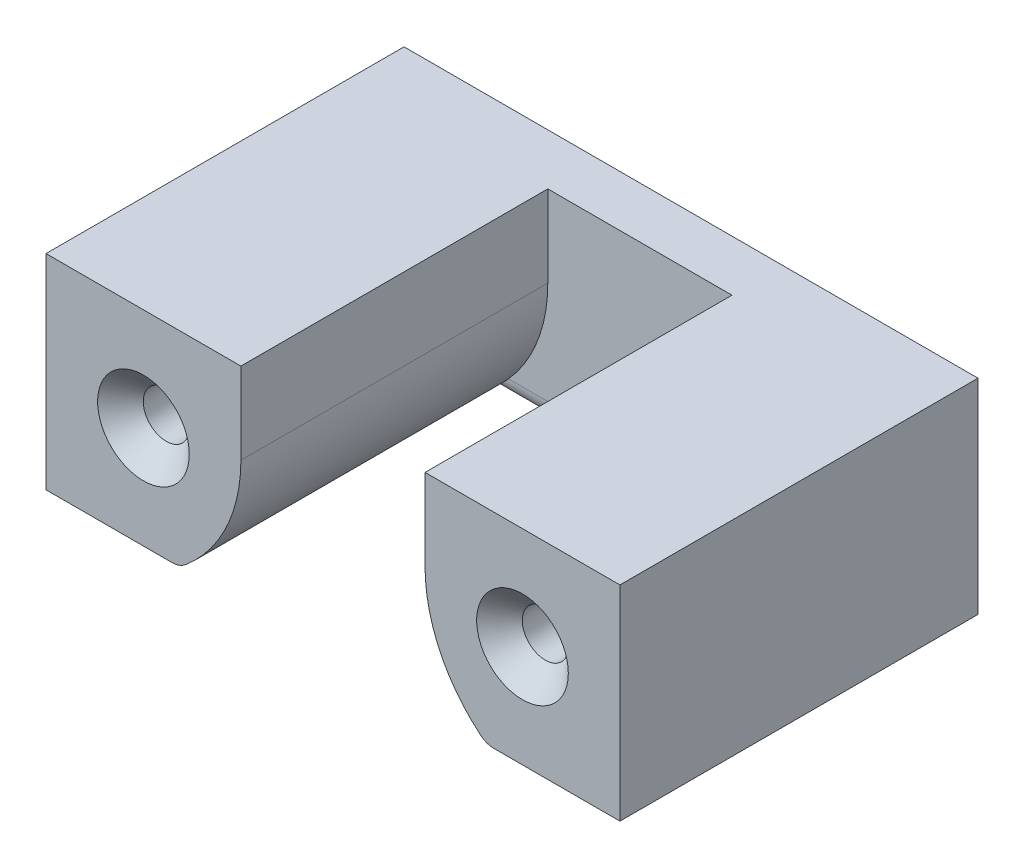
ISO-10303-21;
HEADER;
FILE_DESCRIPTION(('STEP AP214'),'2;1');
FILE_NAME('part.step','',(''),(''),'','','');
FILE_SCHEMA(('AUTOMOTIVE_DESIGN { 1 0 10303 214 1 1 1 1 }'));
ENDSEC;
DATA;
#1=APPLICATION_CONTEXT('core data for automotive mechanical design processes');
#2=APPLICATION_PROTOCOL_DEFINITION('international standard','automotive_design',2000,#1);
#3=PRODUCT_CONTEXT('',#1,'mechanical');
#4=PRODUCT('Part','Part','',(#3));
#5=PRODUCT_RELATED_PRODUCT_CATEGORY('part','',(#4));
#6=PRODUCT_DEFINITION_FORMATION('','',#4);
#7=PRODUCT_DEFINITION_CONTEXT('part definition',#1,'design');
#8=PRODUCT_DEFINITION('design','',#6,#7);
#9=PRODUCT_DEFINITION_SHAPE('','',#8);
#10=(LENGTH_UNIT() NAMED_UNIT(*) SI_UNIT(.MILLI.,.METRE.));
#11=(NAMED_UNIT(*) PLANE_ANGLE_UNIT() SI_UNIT($,.RADIAN.));
#12=(NAMED_UNIT(*) SI_UNIT($,.STERADIAN.) SOLID_ANGLE_UNIT());
#13=UNCERTAINTY_MEASURE_WITH_UNIT(LENGTH_MEASURE(1.E-05),#10,'distance_accuracy_value','');
#14=(GEOMETRIC_REPRESENTATION_CONTEXT(3) GLOBAL_UNCERTAINTY_ASSIGNED_CONTEXT((#13)) GLOBAL_UNIT_ASSIGNED_CONTEXT((#10,
#11,#12)) REPRESENTATION_CONTEXT('',''));
#15=CARTESIAN_POINT('',(0.,0.,0.));
#16=DIRECTION('',(0.,0.,1.));
#17=DIRECTION('',(1.,0.,0.));
#18=AXIS2_PLACEMENT_3D('',#15,#16,#17);
#19=CARTESIAN_POINT('',(0.,0.,5.));
#20=DIRECTION('',(0.,0.,-1.));
#21=DIRECTION('',(-1.,0.,0.));
#22=AXIS2_PLACEMENT_3D('',#19,#20,#21);
#23=PLANE('',#22);
#24=CARTESIAN_POINT('',(4.05,12.0256241897666,5.));
#25=DIRECTION('',(0.,0.,1.));
#26=DIRECTION('',(1.,0.,0.));
#27=AXIS2_PLACEMENT_3D('',#24,#25,#26);
#28=CIRCLE('',#27,15.);
#29=CARTESIAN_POINT('',(15.2073679515182,2.,5.));
#30=VERTEX_POINT('',#29);
#31=CARTESIAN_POINT('',(19.05,12.0256241897666,5.));
#32=VERTEX_POINT('',#31);
#33=EDGE_CURVE('E165',#30,#32,#28,.T.);
#34=ORIENTED_EDGE('',*,*,#33,.F.);
#35=DIRECTION('',(1.,0.,0.));
#36=VECTOR('',#35,1.);
#37=CARTESIAN_POINT('',(0.,2.,5.));
#38=LINE('',#37,#36);
#39=CARTESIAN_POINT('',(40.8926320484818,2.,5.));
#40=VERTEX_POINT('',#39);
#41=EDGE_CURVE('E296',#30,#40,#38,.T.);
#42=ORIENTED_EDGE('',*,*,#41,.T.);
#43=CARTESIAN_POINT('',(52.05,12.0256241897666,5.));
#44=DIRECTION('',(0.,0.,1.));
#45=DIRECTION('',(1.,0.,0.));
#46=AXIS2_PLACEMENT_3D('',#43,#44,#45);
#47=CIRCLE('',#46,15.);
#48=CARTESIAN_POINT('',(37.05,12.0256241897666,5.));
#49=VERTEX_POINT('',#48);
#50=EDGE_CURVE('E186',#40,#49,#47,.F.);
#51=ORIENTED_EDGE('',*,*,#50,.T.);
#52=DIRECTION('',(0.,-1.,0.));
#53=VECTOR('',#52,1.);
#54=CARTESIAN_POINT('',(37.05,0.,5.));
#55=LINE('',#54,#53);
#56=CARTESIAN_POINT('',(37.05,20.,5.));
#57=VERTEX_POINT('',#56);
#58=EDGE_CURVE('E182',#57,#49,#55,.T.);
#59=ORIENTED_EDGE('',*,*,#58,.F.);
#60=DIRECTION('',(1.,0.,0.));
#61=VECTOR('',#60,1.);
#62=CARTESIAN_POINT('',(0.,20.,5.));
#63=LINE('',#62,#61);
#64=CARTESIAN_POINT('',(19.05,20.,5.));
#65=VERTEX_POINT('',#64);
#66=EDGE_CURVE('E250',#65,#57,#63,.T.);
#67=ORIENTED_EDGE('',*,*,#66,.F.);
#68=DIRECTION('',(0.,-1.,0.));
#69=VECTOR('',#68,1.);
#70=CARTESIAN_POINT('',(19.05,0.,5.));
#71=LINE('',#70,#69);
#72=EDGE_CURVE('E215',#65,#32,#71,.T.);
#73=ORIENTED_EDGE('',*,*,#72,.T.);
#74=EDGE_LOOP('',(#34,#42,#51,#59,#67,#73));
#75=FACE_BOUND('',#74,.T.);
#76=ADVANCED_FACE('F47',(#75),#23,.F.);
#77=CARTESIAN_POINT('',(0.,0.,5.));
#78=DIRECTION('',(-1.,0.,0.));
#79=DIRECTION('',(0.,0.,1.));
#80=AXIS2_PLACEMENT_3D('',#77,#78,#79);
#81=PLANE('',#80);
#82=DIRECTION('',(0.,1.,0.));
#83=VECTOR('',#82,1.);
#84=CARTESIAN_POINT('',(0.,0.,0.));
#85=LINE('',#84,#83);
#86=CARTESIAN_POINT('',(0.,0.,0.));
#87=VERTEX_POINT('',#86);
#88=CARTESIAN_POINT('',(0.,20.,0.));
#89=VERTEX_POINT('',#88);
#90=EDGE_CURVE('E249',#87,#89,#85,.T.);
#91=ORIENTED_EDGE('',*,*,#90,.F.);
#92=DIRECTION('',(0.,0.,-1.));
#93=VECTOR('',#92,1.);
#94=CARTESIAN_POINT('',(0.,0.,5.));
#95=LINE('',#94,#93);
#96=CARTESIAN_POINT('',(0.,0.,35.));
#97=VERTEX_POINT('',#96);
#98=EDGE_CURVE('E269',#97,#87,#95,.T.);
#99=ORIENTED_EDGE('',*,*,#98,.F.);
#100=DIRECTION('',(0.,-1.,0.));
#101=VECTOR('',#100,1.);
#102=CARTESIAN_POINT('',(0.,0.,35.));
#103=LINE('',#102,#101);
#104=CARTESIAN_POINT('',(0.,20.,35.));
#105=VERTEX_POINT('',#104);
#106=EDGE_CURVE('E226',#105,#97,#103,.T.);
#107=ORIENTED_EDGE('',*,*,#106,.F.);
#108=DIRECTION('',(0.,0.,-1.));
#109=VECTOR('',#108,1.);
#110=CARTESIAN_POINT('',(0.,20.,5.));
#111=LINE('',#110,#109);
#112=EDGE_CURVE('E254',#105,#89,#111,.T.);
#113=ORIENTED_EDGE('',*,*,#112,.T.);
#114=EDGE_LOOP('',(#91,#99,#107,#113));
#115=FACE_BOUND('',#114,.T.);
#116=ADVANCED_FACE('F391',(#115),#81,.T.);
#117=CARTESIAN_POINT('',(0.,0.,5.));
#118=DIRECTION('',(0.,1.,0.));
#119=DIRECTION('',(0.,0.,1.));
#120=AXIS2_PLACEMENT_3D('',#117,#118,#119);
#121=PLANE('',#120);
#122=DIRECTION('',(1.,0.,0.));
#123=VECTOR('',#122,1.);
#124=CARTESIAN_POINT('',(0.,0.,35.));
#125=LINE('',#124,#123);
#126=CARTESIAN_POINT('',(43.7740998703627,0.,35.));
#127=VERTEX_POINT('',#126);
#128=CARTESIAN_POINT('',(56.1,0.,35.));
#129=VERTEX_POINT('',#128);
#130=EDGE_CURVE('E175',#127,#129,#125,.T.);
#131=ORIENTED_EDGE('',*,*,#130,.F.);
#132=DIRECTION('',(0.,0.,-1.));
#133=VECTOR('',#132,1.);
#134=CARTESIAN_POINT('',(43.7740998703627,0.,5.));
#135=LINE('',#134,#133);
#136=CARTESIAN_POINT('',(43.7740998703627,0.,3.));
#137=VERTEX_POINT('',#136);
#138=EDGE_CURVE('E287',#127,#137,#135,.T.);
#139=ORIENTED_EDGE('',*,*,#138,.T.);
#140=DIRECTION('',(1.,0.,0.));
#141=VECTOR('',#140,1.);
#142=CARTESIAN_POINT('',(0.,0.,3.));
#143=LINE('',#142,#141);
#144=CARTESIAN_POINT('',(12.3259001296373,0.,3.));
#145=VERTEX_POINT('',#144);
#146=EDGE_CURVE('E284',#137,#145,#143,.F.);
#147=ORIENTED_EDGE('',*,*,#146,.T.);
#148=DIRECTION('',(0.,0.,-1.));
#149=VECTOR('',#148,1.);
#150=CARTESIAN_POINT('',(12.3259001296373,0.,35.));
#151=LINE('',#150,#149);
#152=CARTESIAN_POINT('',(12.3259001296373,0.,35.));
#153=VERTEX_POINT('',#152);
#154=EDGE_CURVE('E272',#145,#153,#151,.F.);
#155=ORIENTED_EDGE('',*,*,#154,.T.);
#156=DIRECTION('',(1.,0.,0.));
#157=VECTOR('',#156,1.);
#158=CARTESIAN_POINT('',(0.,0.,35.));
#159=LINE('',#158,#157);
#160=EDGE_CURVE('E230',#97,#153,#159,.T.);
#161=ORIENTED_EDGE('',*,*,#160,.F.);
#162=ORIENTED_EDGE('',*,*,#98,.T.);
#163=DIRECTION('',(1.,0.,0.));
#164=VECTOR('',#163,1.);
#165=CARTESIAN_POINT('',(0.,0.,0.));
#166=LINE('',#165,#164);
#167=CARTESIAN_POINT('',(56.1,0.,0.));
#168=VERTEX_POINT('',#167);
#169=EDGE_CURVE('E255',#87,#168,#166,.T.);
#170=ORIENTED_EDGE('',*,*,#169,.T.);
#171=DIRECTION('',(0.,0.,-1.));
#172=VECTOR('',#171,1.);
#173=CARTESIAN_POINT('',(56.1,0.,5.));
#174=LINE('',#173,#172);
#175=EDGE_CURVE('E273',#129,#168,#174,.T.);
#176=ORIENTED_EDGE('',*,*,#175,.F.);
#177=EDGE_LOOP('',(#131,#139,#147,#155,#161,#162,#170,#176));
#178=FACE_BOUND('',#177,.T.);
#179=ADVANCED_FACE('F403',(#178),#121,.F.);
#180=CARTESIAN_POINT('',(56.1,0.,5.));
#181=DIRECTION('',(-1.,0.,0.));
#182=DIRECTION('',(0.,0.,1.));
#183=AXIS2_PLACEMENT_3D('',#180,#181,#182);
#184=PLANE('',#183);
#185=DIRECTION('',(0.,1.,0.));
#186=VECTOR('',#185,1.);
#187=CARTESIAN_POINT('',(56.1,0.,0.));
#188=LINE('',#187,#186);
#189=CARTESIAN_POINT('',(56.1,20.,0.));
#190=VERTEX_POINT('',#189);
#191=EDGE_CURVE('E263',#168,#190,#188,.T.);
#192=ORIENTED_EDGE('',*,*,#191,.T.);
#193=DIRECTION('',(0.,0.,-1.));
#194=VECTOR('',#193,1.);
#195=CARTESIAN_POINT('',(56.1,20.,5.));
#196=LINE('',#195,#194);
#197=CARTESIAN_POINT('',(56.1,20.,35.));
#198=VERTEX_POINT('',#197);
#199=EDGE_CURVE('E277',#198,#190,#196,.T.);
#200=ORIENTED_EDGE('',*,*,#199,.F.);
#201=DIRECTION('',(0.,1.,0.));
#202=VECTOR('',#201,1.);
#203=CARTESIAN_POINT('',(56.1,0.,35.));
#204=LINE('',#203,#202);
#205=EDGE_CURVE('E194',#129,#198,#204,.T.);
#206=ORIENTED_EDGE('',*,*,#205,.F.);
#207=ORIENTED_EDGE('',*,*,#175,.T.);
#208=EDGE_LOOP('',(#192,#200,#206,#207));
#209=FACE_BOUND('',#208,.T.);
#210=ADVANCED_FACE('F399',(#209),#184,.F.);
#211=CARTESIAN_POINT('',(0.,20.,5.));
#212=DIRECTION('',(0.,1.,0.));
#213=DIRECTION('',(0.,0.,1.));
#214=AXIS2_PLACEMENT_3D('',#211,#212,#213);
#215=PLANE('',#214);
#216=DIRECTION('',(1.,0.,0.));
#217=VECTOR('',#216,1.);
#218=CARTESIAN_POINT('',(0.,20.,0.));
#219=LINE('',#218,#217);
#220=EDGE_CURVE('E259',#89,#190,#219,.T.);
#221=ORIENTED_EDGE('',*,*,#220,.F.);
#222=ORIENTED_EDGE('',*,*,#112,.F.);
#223=DIRECTION('',(-1.,0.,0.));
#224=VECTOR('',#223,1.);
#225=CARTESIAN_POINT('',(0.,20.,35.));
#226=LINE('',#225,#224);
#227=CARTESIAN_POINT('',(19.05,20.,35.));
#228=VERTEX_POINT('',#227);
#229=EDGE_CURVE('E222',#228,#105,#226,.T.);
#230=ORIENTED_EDGE('',*,*,#229,.F.);
#231=DIRECTION('',(0.,0.,-1.));
#232=VECTOR('',#231,1.);
#233=CARTESIAN_POINT('',(19.05,20.,35.));
#234=LINE('',#233,#232);
#235=EDGE_CURVE('E234',#228,#65,#234,.T.);
#236=ORIENTED_EDGE('',*,*,#235,.T.);
#237=ORIENTED_EDGE('',*,*,#66,.T.);
#238=DIRECTION('',(0.,0.,-1.));
#239=VECTOR('',#238,1.);
#240=CARTESIAN_POINT('',(37.05,20.,35.));
#241=LINE('',#240,#239);
#242=CARTESIAN_POINT('',(37.05,20.,35.));
#243=VERTEX_POINT('',#242);
#244=EDGE_CURVE('E166',#243,#57,#241,.T.);
#245=ORIENTED_EDGE('',*,*,#244,.F.);
#246=DIRECTION('',(-1.,0.,0.));
#247=VECTOR('',#246,1.);
#248=CARTESIAN_POINT('',(0.,20.,35.));
#249=LINE('',#248,#247);
#250=EDGE_CURVE('E198',#198,#243,#249,.T.);
#251=ORIENTED_EDGE('',*,*,#250,.F.);
#252=ORIENTED_EDGE('',*,*,#199,.T.);
#253=EDGE_LOOP('',(#221,#222,#230,#236,#237,#245,#251,#252));
#254=FACE_BOUND('',#253,.T.);
#255=ADVANCED_FACE('F383',(#254),#215,.T.);
#256=CARTESIAN_POINT('',(0.,0.,0.));
#257=DIRECTION('',(0.,0.,-1.));
#258=DIRECTION('',(-1.,0.,0.));
#259=AXIS2_PLACEMENT_3D('',#256,#257,#258);
#260=PLANE('',#259);
#261=CARTESIAN_POINT('',(9.525,10.,0.));
#262=DIRECTION('',(0.,0.,-1.));
#263=DIRECTION('',(-1.,0.,0.));
#264=AXIS2_PLACEMENT_3D('',#261,#262,#263);
#265=CIRCLE('',#264,2.25);
#266=CARTESIAN_POINT('',(7.275,10.,0.));
#267=VERTEX_POINT('',#266);
#268=EDGE_CURVE('E360',#267,#267,#265,.T.);
#269=ORIENTED_EDGE('',*,*,#268,.F.);
#270=EDGE_LOOP('',(#269));
#271=FACE_BOUND('',#270,.T.);
#272=CARTESIAN_POINT('',(46.575,10.,0.));
#273=DIRECTION('',(0.,0.,-1.));
#274=DIRECTION('',(-1.,0.,0.));
#275=AXIS2_PLACEMENT_3D('',#272,#273,#274);
#276=CIRCLE('',#275,2.25);
#277=CARTESIAN_POINT('',(44.325,10.,0.));
#278=VERTEX_POINT('',#277);
#279=EDGE_CURVE('E189',#278,#278,#276,.T.);
#280=ORIENTED_EDGE('',*,*,#279,.F.);
#281=EDGE_LOOP('',(#280));
#282=FACE_BOUND('',#281,.T.);
#283=ORIENTED_EDGE('',*,*,#90,.T.);
#284=ORIENTED_EDGE('',*,*,#220,.T.);
#285=ORIENTED_EDGE('',*,*,#191,.F.);
#286=ORIENTED_EDGE('',*,*,#169,.F.);
#287=EDGE_LOOP('',(#283,#284,#285,#286));
#288=FACE_BOUND('',#287,.T.);
#289=ADVANCED_FACE('F380',(#271,#282,#288),#260,.T.);
#290=CARTESIAN_POINT('',(5.34836065573767,-6.41803278688524,35.));
#291=DIRECTION('',(0.640184399664477,-0.768221279597378,0.));
#292=DIRECTION('',(0.768221279597378,0.640184399664477,0.));
#293=AXIS2_PLACEMENT_3D('',#290,#291,#292);
#294=PLANE('',#293);
#295=DIRECTION('',(-0.768221279597378,-0.640184399664477,0.));
#296=VECTOR('',#295,1.);
#297=CARTESIAN_POINT('',(5.34836065573767,-6.41803278688524,35.));
#298=LINE('',#297,#296);
#299=CARTESIAN_POINT('',(13.6527659949672,0.502304995805996,35.));
#300=VERTEX_POINT('',#299);
#301=CARTESIAN_POINT('',(13.6062689289663,0.463557440805246,35.));
#302=VERTEX_POINT('',#301);
#303=EDGE_CURVE('E210',#300,#302,#298,.T.);
#304=ORIENTED_EDGE('',*,*,#303,.T.);
#305=DIRECTION('',(0.,0.,-1.));
#306=VECTOR('',#305,1.);
#307=CARTESIAN_POINT('',(13.6062689289663,0.463557440805246,5.));
#308=LINE('',#307,#306);
#309=CARTESIAN_POINT('',(13.6062689289663,0.463557440805246,4.28036879932896));
#310=VERTEX_POINT('',#309);
#311=EDGE_CURVE('E299',#302,#310,#308,.T.);
#312=ORIENTED_EDGE('',*,*,#311,.T.);
#313=CARTESIAN_POINT('',(15.45,2.,3.));
#314=DIRECTION('',(0.640184399664477,-0.768221279597378,0.));
#315=DIRECTION('',(0.768221279597378,0.640184399664477,0.));
#316=AXIS2_PLACEMENT_3D('',#313,#314,#315);
#317=ELLIPSE('',#316,3.12409987036267,2.);
#318=CARTESIAN_POINT('',(13.6527659949672,0.502304995805996,4.32548469414487));
#319=VERTEX_POINT('',#318);
#320=EDGE_CURVE('E57',#310,#319,#317,.F.);
#321=ORIENTED_EDGE('',*,*,#320,.T.);
#322=DIRECTION('',(0.,0.,-1.));
#323=VECTOR('',#322,1.);
#324=CARTESIAN_POINT('',(13.6527659949672,0.502304995805996,35.));
#325=LINE('',#324,#323);
#326=EDGE_CURVE('E64',#300,#319,#325,.T.);
#327=ORIENTED_EDGE('',*,*,#326,.F.);
#328=EDGE_LOOP('',(#304,#312,#321,#327));
#329=FACE_BOUND('',#328,.T.);
#330=ADVANCED_FACE('F334',(#329),#294,.T.);
#331=CARTESIAN_POINT('',(4.05,12.0256241897666,35.));
#332=DIRECTION('',(0.,0.,-1.));
#333=DIRECTION('',(-1.,0.,0.));
#334=AXIS2_PLACEMENT_3D('',#331,#332,#333);
#335=CYLINDRICAL_SURFACE('',#334,15.);
#336=ORIENTED_EDGE('',*,*,#326,.T.);
#337=CARTESIAN_POINT('',(13.6527659949672,0.502304995805996,4.32548469414487));
#338=CARTESIAN_POINT('',(13.7054888306372,0.546232709914975,4.37507918546173));
#339=CARTESIAN_POINT('',(13.7594979169966,0.591860793693975,4.4217091785404));
#340=CARTESIAN_POINT('',(13.8693971688525,0.686108137742407,4.50925428347499));
#341=CARTESIAN_POINT('',(13.9252855919425,0.73472466015836,4.55017451714186));
#342=CARTESIAN_POINT('',(14.0384586312911,0.834716285252311,4.62667654443475));
#343=CARTESIAN_POINT('',(14.0957457320905,0.886096526688044,4.66224789144895));
#344=CARTESIAN_POINT('',(14.2111556892482,0.99126777817051,4.72809393619407));
#345=CARTESIAN_POINT('',(14.2692787980021,1.04505952709991,4.75836699641033));
#346=CARTESIAN_POINT('',(14.4587838133128,1.2233304511454,4.84821592772636));
#347=CARTESIAN_POINT('',(14.5911107551457,1.35228653267758,4.89724030216739));
#348=CARTESIAN_POINT('',(14.8541041014704,1.61859650073199,4.96810812612382));
#349=CARTESIAN_POINT('',(14.9847734606816,1.75593176665286,4.99000969528178));
#350=CARTESIAN_POINT('',(15.1446347959692,1.93051043466516,4.99908894064817));
#351=CARTESIAN_POINT('',(15.1760872657182,1.96518406452759,4.99999643009194));
#352=CARTESIAN_POINT('',(15.2073679515182,2.,5.));
#353=B_SPLINE_CURVE_WITH_KNOTS('',3,(#337,#338,#339,#340,#341,#342,#343,#344,#345,#346,#347,
#348,#349,#350,#351,#352),.UNSPECIFIED.,.F.,.F.,(4,2,2,2,2,2,2,4),(0.,0.253851827934849,
0.507474459420807,0.761586167231691,1.0157762739005,1.58703617177933,2.15706982501783,
2.29750199771418),.UNSPECIFIED.);
#354=EDGE_CURVE('E11',#319,#30,#353,.T.);
#355=ORIENTED_EDGE('',*,*,#354,.T.);
#356=ORIENTED_EDGE('',*,*,#33,.T.);
#357=DIRECTION('',(0.,0.,-1.));
#358=VECTOR('',#357,1.);
#359=CARTESIAN_POINT('',(19.05,12.0256241897666,35.));
#360=LINE('',#359,#358);
#361=CARTESIAN_POINT('',(19.05,12.0256241897666,35.));
#362=VERTEX_POINT('',#361);
#363=EDGE_CURVE('E243',#362,#32,#360,.T.);
#364=ORIENTED_EDGE('',*,*,#363,.F.);
#365=CARTESIAN_POINT('',(4.05,12.0256241897666,35.));
#366=DIRECTION('',(0.,0.,1.));
#367=DIRECTION('',(1.,0.,0.));
#368=AXIS2_PLACEMENT_3D('',#365,#366,#367);
#369=CIRCLE('',#368,15.);
#370=EDGE_CURVE('E214',#300,#362,#369,.T.);
#371=ORIENTED_EDGE('',*,*,#370,.F.);
#372=EDGE_LOOP('',(#336,#355,#356,#364,#371));
#373=FACE_BOUND('',#372,.T.);
#374=ADVANCED_FACE('F329',(#373),#335,.T.);
#375=CARTESIAN_POINT('',(19.05,0.,35.));
#376=DIRECTION('',(1.,0.,0.));
#377=DIRECTION('',(0.,0.,-1.));
#378=AXIS2_PLACEMENT_3D('',#375,#376,#377);
#379=PLANE('',#378);
#380=ORIENTED_EDGE('',*,*,#72,.F.);
#381=ORIENTED_EDGE('',*,*,#235,.F.);
#382=DIRECTION('',(0.,-1.,0.));
#383=VECTOR('',#382,1.);
#384=CARTESIAN_POINT('',(19.05,0.,35.));
#385=LINE('',#384,#383);
#386=EDGE_CURVE('E218',#228,#362,#385,.T.);
#387=ORIENTED_EDGE('',*,*,#386,.T.);
#388=ORIENTED_EDGE('',*,*,#363,.T.);
#389=EDGE_LOOP('',(#380,#381,#387,#388));
#390=FACE_BOUND('',#389,.T.);
#391=ADVANCED_FACE('F325',(#390),#379,.T.);
#392=CARTESIAN_POINT('',(0.,0.,35.));
#393=DIRECTION('',(0.,0.,1.));
#394=DIRECTION('',(1.,0.,0.));
#395=AXIS2_PLACEMENT_3D('',#392,#393,#394);
#396=PLANE('',#395);
#397=CARTESIAN_POINT('',(9.525,10.,35.));
#398=DIRECTION('',(0.,0.,1.));
#399=DIRECTION('',(1.,0.,0.));
#400=AXIS2_PLACEMENT_3D('',#397,#398,#399);
#401=CIRCLE('',#400,4.48);
#402=CARTESIAN_POINT('',(14.005,10.,35.));
#403=VERTEX_POINT('',#402);
#404=EDGE_CURVE('E348',#403,#403,#401,.T.);
#405=ORIENTED_EDGE('',*,*,#404,.F.);
#406=EDGE_LOOP('',(#405));
#407=FACE_BOUND('',#406,.T.);
#408=ORIENTED_EDGE('',*,*,#160,.T.);
#409=CARTESIAN_POINT('',(12.3259001296373,2.,35.));
#410=DIRECTION('',(0.,0.,1.));
#411=DIRECTION('',(1.,0.,0.));
#412=AXIS2_PLACEMENT_3D('',#409,#410,#411);
#413=CIRCLE('',#412,2.);
#414=EDGE_CURVE('E302',#153,#302,#413,.T.);
#415=ORIENTED_EDGE('',*,*,#414,.T.);
#416=ORIENTED_EDGE('',*,*,#303,.F.);
#417=ORIENTED_EDGE('',*,*,#370,.T.);
#418=ORIENTED_EDGE('',*,*,#386,.F.);
#419=ORIENTED_EDGE('',*,*,#229,.T.);
#420=ORIENTED_EDGE('',*,*,#106,.T.);
#421=EDGE_LOOP('',(#408,#415,#416,#417,#418,#419,#420));
#422=FACE_BOUND('',#421,.T.);
#423=ADVANCED_FACE('F321',(#407,#422),#396,.T.);
#424=CARTESIAN_POINT('',(52.05,12.0256241897666,35.));
#425=DIRECTION('',(0.,0.,-1.));
#426=DIRECTION('',(-1.,0.,0.));
#427=AXIS2_PLACEMENT_3D('',#424,#425,#426);
#428=CYLINDRICAL_SURFACE('',#427,15.);
#429=ORIENTED_EDGE('',*,*,#50,.F.);
#430=CARTESIAN_POINT('',(40.8926320484818,2.,5.));
#431=CARTESIAN_POINT('',(40.9635989802681,1.92100579210601,4.99997838340194));
#432=CARTESIAN_POINT('',(41.0353988391777,1.84280346754277,4.99532065499818));
#433=CARTESIAN_POINT('',(41.1800833851627,1.68850627201688,4.97712562352008));
#434=CARTESIAN_POINT('',(41.2529676952014,1.61241069375037,4.96359133921717));
#435=CARTESIAN_POINT('',(41.3974060685535,1.46472172815553,4.9284928798584));
#436=CARTESIAN_POINT('',(41.4689460866364,1.39306287223105,4.90714434852875));
#437=CARTESIAN_POINT('',(41.6120338808784,1.2525601514975,4.85658558442278));
#438=CARTESIAN_POINT('',(41.6835816571969,1.18371651484495,4.8273747159003));
#439=CARTESIAN_POINT('',(41.8139810046445,1.06065564762331,4.76677786481894));
#440=CARTESIAN_POINT('',(41.8729265070642,1.00593901349937,4.7366023993534));
#441=CARTESIAN_POINT('',(41.9899821146996,0.898974848780428,4.67083271810237));
#442=CARTESIAN_POINT('',(42.0480925808448,0.846726227640123,4.6352409255525));
#443=CARTESIAN_POINT('',(42.1642866493336,0.743833335787268,4.5576573058025));
#444=CARTESIAN_POINT('',(42.2223419610795,0.693249004770263,4.51554270499841));
#445=CARTESIAN_POINT('',(42.3364711450416,0.595266346369753,4.42518015405696));
#446=CARTESIAN_POINT('',(42.3925427043482,0.54787168337425,4.37692532771946));
#447=CARTESIAN_POINT('',(42.4472340050328,0.502304995806004,4.32548469414488));
#448=B_SPLINE_CURVE_WITH_KNOTS('',3,(#430,#431,#432,#433,#434,#435,#436,#437,#438,#439,#440,
#441,#442,#443,#444,#445,#446,#447),.UNSPECIFIED.,.F.,.F.,(4,2,2,2,2,2,2,2,4),(0.,
0.318419269035516,0.636730304999946,0.946848480671857,1.25699173994092,1.51449899299887,
1.77189137556953,2.03490380648095,2.29821341057932),.UNSPECIFIED.);
#449=CARTESIAN_POINT('',(42.4472340050328,0.502304995806002,4.32548469414488));
#450=VERTEX_POINT('',#449);
#451=EDGE_CURVE('E162',#40,#450,#448,.T.);
#452=ORIENTED_EDGE('',*,*,#451,.T.);
#453=DIRECTION('',(0.,0.,-1.));
#454=VECTOR('',#453,1.);
#455=CARTESIAN_POINT('',(42.4472340050328,0.502304995806002,35.));
#456=LINE('',#455,#454);
#457=CARTESIAN_POINT('',(42.4472340050328,0.502304995806002,35.));
#458=VERTEX_POINT('',#457);
#459=EDGE_CURVE('E72',#458,#450,#456,.T.);
#460=ORIENTED_EDGE('',*,*,#459,.F.);
#461=CARTESIAN_POINT('',(52.05,12.0256241897666,35.));
#462=DIRECTION('',(0.,0.,1.));
#463=DIRECTION('',(1.,0.,0.));
#464=AXIS2_PLACEMENT_3D('',#461,#462,#463);
#465=CIRCLE('',#464,15.);
#466=CARTESIAN_POINT('',(37.05,12.0256241897666,35.));
#467=VERTEX_POINT('',#466);
#468=EDGE_CURVE('E160',#458,#467,#465,.F.);
#469=ORIENTED_EDGE('',*,*,#468,.T.);
#470=DIRECTION('',(0.,0.,-1.));
#471=VECTOR('',#470,1.);
#472=CARTESIAN_POINT('',(37.05,12.0256241897666,35.));
#473=LINE('',#472,#471);
#474=EDGE_CURVE('E203',#467,#49,#473,.T.);
#475=ORIENTED_EDGE('',*,*,#474,.T.);
#476=EDGE_LOOP('',(#429,#452,#460,#469,#475));
#477=FACE_BOUND('',#476,.T.);
#478=ADVANCED_FACE('F157',(#477),#428,.T.);
#479=CARTESIAN_POINT('',(17.6434426229506,21.1721311475409,35.));
#480=DIRECTION('',(0.640184399664476,0.768221279597379,0.));
#481=DIRECTION('',(-0.768221279597379,0.640184399664476,0.));
#482=AXIS2_PLACEMENT_3D('',#479,#480,#481);
#483=PLANE('',#482);
#484=ORIENTED_EDGE('',*,*,#459,.T.);
#485=CARTESIAN_POINT('',(40.65,2.,3.));
#486=DIRECTION('',(0.640184399664476,0.768221279597379,0.));
#487=DIRECTION('',(0.768221279597379,-0.640184399664476,0.));
#488=AXIS2_PLACEMENT_3D('',#485,#486,#487);
#489=ELLIPSE('',#488,3.12409987036268,2.);
#490=CARTESIAN_POINT('',(42.4937310710337,0.463557440805241,4.28036879932896));
#491=VERTEX_POINT('',#490);
#492=EDGE_CURVE('E312',#450,#491,#489,.T.);
#493=ORIENTED_EDGE('',*,*,#492,.T.);
#494=DIRECTION('',(0.,0.,-1.));
#495=VECTOR('',#494,1.);
#496=CARTESIAN_POINT('',(42.4937310710337,0.463557440805243,35.));
#497=LINE('',#496,#495);
#498=CARTESIAN_POINT('',(42.4937310710337,0.463557440805243,35.));
#499=VERTEX_POINT('',#498);
#500=EDGE_CURVE('E171',#491,#499,#497,.F.);
#501=ORIENTED_EDGE('',*,*,#500,.T.);
#502=DIRECTION('',(0.768221279597379,-0.640184399664476,0.));
#503=VECTOR('',#502,1.);
#504=CARTESIAN_POINT('',(17.6434426229506,21.1721311475409,35.));
#505=LINE('',#504,#503);
#506=EDGE_CURVE('E169',#458,#499,#505,.T.);
#507=ORIENTED_EDGE('',*,*,#506,.F.);
#508=EDGE_LOOP('',(#484,#493,#501,#507));
#509=FACE_BOUND('',#508,.T.);
#510=ADVANCED_FACE('F170',(#509),#483,.F.);
#511=CARTESIAN_POINT('',(37.05,0.,35.));
#512=DIRECTION('',(1.,0.,0.));
#513=DIRECTION('',(0.,0.,-1.));
#514=AXIS2_PLACEMENT_3D('',#511,#512,#513);
#515=PLANE('',#514);
#516=ORIENTED_EDGE('',*,*,#58,.T.);
#517=ORIENTED_EDGE('',*,*,#474,.F.);
#518=DIRECTION('',(0.,-1.,0.));
#519=VECTOR('',#518,1.);
#520=CARTESIAN_POINT('',(37.05,0.,35.));
#521=LINE('',#520,#519);
#522=EDGE_CURVE('E179',#243,#467,#521,.T.);
#523=ORIENTED_EDGE('',*,*,#522,.F.);
#524=ORIENTED_EDGE('',*,*,#244,.T.);
#525=EDGE_LOOP('',(#516,#517,#523,#524));
#526=FACE_BOUND('',#525,.T.);
#527=ADVANCED_FACE('F420',(#526),#515,.F.);
#528=CARTESIAN_POINT('',(0.,0.,35.));
#529=DIRECTION('',(0.,0.,1.));
#530=DIRECTION('',(1.,0.,0.));
#531=AXIS2_PLACEMENT_3D('',#528,#529,#530);
#532=PLANE('',#531);
#533=CARTESIAN_POINT('',(46.575,10.,35.));
#534=DIRECTION('',(0.,0.,1.));
#535=DIRECTION('',(1.,0.,0.));
#536=AXIS2_PLACEMENT_3D('',#533,#534,#535);
#537=CIRCLE('',#536,4.48);
#538=CARTESIAN_POINT('',(51.055,10.,35.));
#539=VERTEX_POINT('',#538);
#540=EDGE_CURVE('E366',#539,#539,#537,.T.);
#541=ORIENTED_EDGE('',*,*,#540,.F.);
#542=EDGE_LOOP('',(#541));
#543=FACE_BOUND('',#542,.T.);
#544=ORIENTED_EDGE('',*,*,#506,.T.);
#545=CARTESIAN_POINT('',(43.7740998703627,2.,35.));
#546=DIRECTION('',(0.,0.,1.));
#547=DIRECTION('',(1.,0.,0.));
#548=AXIS2_PLACEMENT_3D('',#545,#546,#547);
#549=CIRCLE('',#548,2.);
#550=EDGE_CURVE('E293',#499,#127,#549,.T.);
#551=ORIENTED_EDGE('',*,*,#550,.T.);
#552=ORIENTED_EDGE('',*,*,#130,.T.);
#553=ORIENTED_EDGE('',*,*,#205,.T.);
#554=ORIENTED_EDGE('',*,*,#250,.T.);
#555=ORIENTED_EDGE('',*,*,#522,.T.);
#556=ORIENTED_EDGE('',*,*,#468,.F.);
#557=EDGE_LOOP('',(#544,#551,#552,#553,#554,#555,#556));
#558=FACE_BOUND('',#557,.T.);
#559=ADVANCED_FACE('F177',(#543,#558),#532,.T.);
#560=CARTESIAN_POINT('',(46.575,10.,35.));
#561=DIRECTION('',(0.,0.,1.));
#562=DIRECTION('',(1.,0.,0.));
#563=AXIS2_PLACEMENT_3D('',#560,#561,#562);
#564=CYLINDRICAL_SURFACE('',#563,2.25);
#565=CARTESIAN_POINT('',(46.575,10.,32.77));
#566=DIRECTION('',(0.,0.,1.));
#567=DIRECTION('',(1.,0.,0.));
#568=AXIS2_PLACEMENT_3D('',#565,#566,#567);
#569=CIRCLE('',#568,2.25);
#570=CARTESIAN_POINT('',(48.825,10.,32.77));
#571=VERTEX_POINT('',#570);
#572=EDGE_CURVE('E369',#571,#571,#569,.T.);
#573=ORIENTED_EDGE('',*,*,#572,.T.);
#574=EDGE_LOOP('',(#573));
#575=FACE_BOUND('',#574,.T.);
#576=ORIENTED_EDGE('',*,*,#279,.T.);
#577=EDGE_LOOP('',(#576));
#578=FACE_BOUND('',#577,.T.);
#579=ADVANCED_FACE('F378',(#575,#578),#564,.F.);
#580=CARTESIAN_POINT('',(46.575,10.,35.));
#581=DIRECTION('',(0.,0.,1.));
#582=DIRECTION('',(1.,0.,0.));
#583=AXIS2_PLACEMENT_3D('',#580,#581,#582);
#584=CONICAL_SURFACE('',#583,4.48,0.785398163397447);
#585=ORIENTED_EDGE('',*,*,#572,.F.);
#586=EDGE_LOOP('',(#585));
#587=FACE_BOUND('',#586,.T.);
#588=ORIENTED_EDGE('',*,*,#540,.T.);
#589=EDGE_LOOP('',(#588));
#590=FACE_BOUND('',#589,.T.);
#591=ADVANCED_FACE('F474',(#587,#590),#584,.F.);
#592=CARTESIAN_POINT('',(9.525,10.,35.));
#593=DIRECTION('',(0.,0.,1.));
#594=DIRECTION('',(1.,0.,0.));
#595=AXIS2_PLACEMENT_3D('',#592,#593,#594);
#596=CYLINDRICAL_SURFACE('',#595,2.25);
#597=CARTESIAN_POINT('',(9.525,10.,32.77));
#598=DIRECTION('',(0.,0.,1.));
#599=DIRECTION('',(1.,0.,0.));
#600=AXIS2_PLACEMENT_3D('',#597,#598,#599);
#601=CIRCLE('',#600,2.25);
#602=CARTESIAN_POINT('',(11.775,10.,32.77));
#603=VERTEX_POINT('',#602);
#604=EDGE_CURVE('E354',#603,#603,#601,.T.);
#605=ORIENTED_EDGE('',*,*,#604,.T.);
#606=EDGE_LOOP('',(#605));
#607=FACE_BOUND('',#606,.T.);
#608=ORIENTED_EDGE('',*,*,#268,.T.);
#609=EDGE_LOOP('',(#608));
#610=FACE_BOUND('',#609,.T.);
#611=ADVANCED_FACE('F482',(#607,#610),#596,.F.);
#612=CARTESIAN_POINT('',(9.525,10.,35.));
#613=DIRECTION('',(0.,0.,1.));
#614=DIRECTION('',(1.,0.,0.));
#615=AXIS2_PLACEMENT_3D('',#612,#613,#614);
#616=CONICAL_SURFACE('',#615,4.48,0.785398163397447);
#617=ORIENTED_EDGE('',*,*,#604,.F.);
#618=EDGE_LOOP('',(#617));
#619=FACE_BOUND('',#618,.T.);
#620=ORIENTED_EDGE('',*,*,#404,.T.);
#621=EDGE_LOOP('',(#620));
#622=FACE_BOUND('',#621,.T.);
#623=ADVANCED_FACE('F490',(#619,#622),#616,.F.);
#624=CARTESIAN_POINT('',(12.3259001296373,2.,35.));
#625=DIRECTION('',(0.,0.,1.));
#626=DIRECTION('',(1.,0.,0.));
#627=AXIS2_PLACEMENT_3D('',#624,#625,#626);
#628=CYLINDRICAL_SURFACE('',#627,2.);
#629=ORIENTED_EDGE('',*,*,#414,.F.);
#630=ORIENTED_EDGE('',*,*,#154,.F.);
#631=CARTESIAN_POINT('',(12.3259001296373,2.,3.));
#632=DIRECTION('',(0.707106781186547,0.,-0.707106781186547));
#633=DIRECTION('',(0.707106781186547,0.,0.707106781186547));
#634=AXIS2_PLACEMENT_3D('',#631,#632,#633);
#635=ELLIPSE('',#634,2.82842712474619,2.);
#636=EDGE_CURVE('E51',#310,#145,#635,.T.);
#637=ORIENTED_EDGE('',*,*,#636,.F.);
#638=ORIENTED_EDGE('',*,*,#311,.F.);
#639=EDGE_LOOP('',(#629,#630,#637,#638));
#640=FACE_BOUND('',#639,.T.);
#641=ADVANCED_FACE('F49',(#640),#628,.T.);
#642=CARTESIAN_POINT('',(0.,2.,3.));
#643=DIRECTION('',(1.,0.,0.));
#644=DIRECTION('',(0.,0.,-1.));
#645=AXIS2_PLACEMENT_3D('',#642,#643,#644);
#646=CYLINDRICAL_SURFACE('',#645,2.);
#647=ORIENTED_EDGE('',*,*,#636,.T.);
#648=ORIENTED_EDGE('',*,*,#146,.F.);
#649=CARTESIAN_POINT('',(43.7740998703627,2.,3.));
#650=DIRECTION('',(-0.707106781186547,0.,-0.707106781186547));
#651=DIRECTION('',(0.707106781186547,0.,-0.707106781186547));
#652=AXIS2_PLACEMENT_3D('',#649,#650,#651);
#653=ELLIPSE('',#652,2.82842712474619,2.);
#654=EDGE_CURVE('E340',#491,#137,#653,.F.);
#655=ORIENTED_EDGE('',*,*,#654,.F.);
#656=ORIENTED_EDGE('',*,*,#492,.F.);
#657=ORIENTED_EDGE('',*,*,#451,.F.);
#658=ORIENTED_EDGE('',*,*,#41,.F.);
#659=ORIENTED_EDGE('',*,*,#354,.F.);
#660=ORIENTED_EDGE('',*,*,#320,.F.);
#661=EDGE_LOOP('',(#647,#648,#655,#656,#657,#658,#659,#660));
#662=FACE_BOUND('',#661,.T.);
#663=ADVANCED_FACE('F314',(#662),#646,.T.);
#664=CARTESIAN_POINT('',(43.7740998703627,2.,5.));
#665=DIRECTION('',(0.,0.,-1.));
#666=DIRECTION('',(-1.,0.,0.));
#667=AXIS2_PLACEMENT_3D('',#664,#665,#666);
#668=CYLINDRICAL_SURFACE('',#667,2.);
#669=ORIENTED_EDGE('',*,*,#550,.F.);
#670=ORIENTED_EDGE('',*,*,#500,.F.);
#671=ORIENTED_EDGE('',*,*,#654,.T.);
#672=ORIENTED_EDGE('',*,*,#138,.F.);
#673=EDGE_LOOP('',(#669,#670,#671,#672));
#674=FACE_BOUND('',#673,.T.);
#675=ADVANCED_FACE('F424',(#674),#668,.T.);
#676=CLOSED_SHELL('',(#76,#116,#179,#210,#255,#289,#330,#374,#391,#423,#478,#510,#527,#559,#579,
#591,#611,#623,#641,#663,#675));
#677=MANIFOLD_SOLID_BREP('B2',#676);
#678=ADVANCED_BREP_SHAPE_REPRESENTATION('',(#18,#677),#14);
#679=SHAPE_DEFINITION_REPRESENTATION(#9,#678);
ENDSEC;
END-ISO-10303-21;
